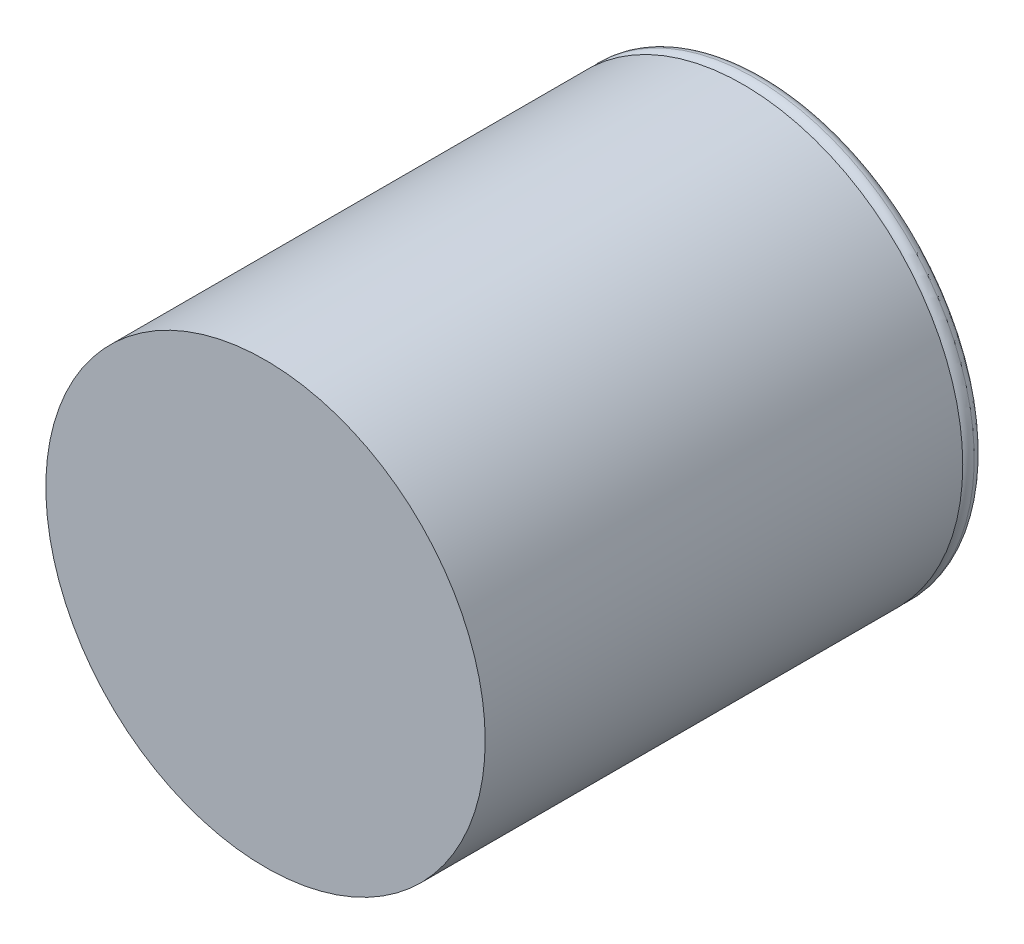
ISO-10303-21;
HEADER;
FILE_DESCRIPTION(('STEP AP214'),'2;1');
FILE_NAME('part.step','',(''),(''),'','','');
FILE_SCHEMA(('AUTOMOTIVE_DESIGN { 1 0 10303 214 1 1 1 1 }'));
ENDSEC;
DATA;
#1=APPLICATION_CONTEXT('core data for automotive mechanical design processes');
#2=APPLICATION_PROTOCOL_DEFINITION('international standard','automotive_design',2000,#1);
#3=PRODUCT_CONTEXT('',#1,'mechanical');
#4=PRODUCT('Part','Part','',(#3));
#5=PRODUCT_RELATED_PRODUCT_CATEGORY('part','',(#4));
#6=PRODUCT_DEFINITION_FORMATION('','',#4);
#7=PRODUCT_DEFINITION_CONTEXT('part definition',#1,'design');
#8=PRODUCT_DEFINITION('design','',#6,#7);
#9=PRODUCT_DEFINITION_SHAPE('','',#8);
#10=(LENGTH_UNIT() NAMED_UNIT(*) SI_UNIT(.MILLI.,.METRE.));
#11=(NAMED_UNIT(*) PLANE_ANGLE_UNIT() SI_UNIT($,.RADIAN.));
#12=(NAMED_UNIT(*) SI_UNIT($,.STERADIAN.) SOLID_ANGLE_UNIT());
#13=UNCERTAINTY_MEASURE_WITH_UNIT(LENGTH_MEASURE(1.E-05),#10,'distance_accuracy_value','');
#14=(GEOMETRIC_REPRESENTATION_CONTEXT(3) GLOBAL_UNCERTAINTY_ASSIGNED_CONTEXT((#13)) GLOBAL_UNIT_ASSIGNED_CONTEXT((#10,
#11,#12)) REPRESENTATION_CONTEXT('',''));
#15=CARTESIAN_POINT('',(0.,0.,0.));
#16=DIRECTION('',(0.,0.,1.));
#17=DIRECTION('',(1.,0.,0.));
#18=AXIS2_PLACEMENT_3D('',#15,#16,#17);
#19=CARTESIAN_POINT('',(0.,0.,25.));
#20=DIRECTION('',(0.,0.,-1.));
#21=DIRECTION('',(-1.,0.,0.));
#22=AXIS2_PLACEMENT_3D('',#19,#20,#21);
#23=CYLINDRICAL_SURFACE('',#22,11.5);
#24=CARTESIAN_POINT('',(0.,0.,25.));
#25=DIRECTION('',(0.,0.,1.));
#26=DIRECTION('',(1.,0.,0.));
#27=AXIS2_PLACEMENT_3D('',#24,#25,#26);
#28=CIRCLE('',#27,11.5);
#29=CARTESIAN_POINT('',(11.5,0.,25.));
#30=VERTEX_POINT('',#29);
#31=EDGE_CURVE('E60',#30,#30,#28,.T.);
#32=ORIENTED_EDGE('',*,*,#31,.F.);
#33=EDGE_LOOP('',(#32));
#34=FACE_BOUND('',#33,.T.);
#35=CARTESIAN_POINT('',(0.,0.,0.));
#36=DIRECTION('',(0.,0.,1.));
#37=DIRECTION('',(1.,0.,0.));
#38=AXIS2_PLACEMENT_3D('',#35,#36,#37);
#39=CIRCLE('',#38,11.5);
#40=CARTESIAN_POINT('',(11.5,0.,0.));
#41=VERTEX_POINT('',#40);
#42=EDGE_CURVE('E57',#41,#41,#39,.T.);
#43=ORIENTED_EDGE('',*,*,#42,.T.);
#44=EDGE_LOOP('',(#43));
#45=FACE_BOUND('',#44,.T.);
#46=ADVANCED_FACE('F33',(#34,#45),#23,.T.);
#47=CARTESIAN_POINT('',(0.,0.,25.));
#48=DIRECTION('',(0.,0.,1.));
#49=DIRECTION('',(1.,0.,0.));
#50=AXIS2_PLACEMENT_3D('',#47,#48,#49);
#51=PLANE('',#50);
#52=ORIENTED_EDGE('',*,*,#31,.T.);
#53=EDGE_LOOP('',(#52));
#54=FACE_BOUND('',#53,.T.);
#55=ADVANCED_FACE('F95',(#54),#51,.T.);
#56=CARTESIAN_POINT('',(0.,0.,0.));
#57=DIRECTION('',(0.,0.,1.));
#58=DIRECTION('',(1.,0.,0.));
#59=AXIS2_PLACEMENT_3D('',#56,#57,#58);
#60=PLANE('',#59);
#61=CARTESIAN_POINT('',(0.,0.,0.));
#62=DIRECTION('',(0.,0.,-1.));
#63=DIRECTION('',(-1.,0.,0.));
#64=AXIS2_PLACEMENT_3D('',#61,#62,#63);
#65=CIRCLE('',#64,7.5);
#66=CARTESIAN_POINT('',(-7.5,0.,0.));
#67=VERTEX_POINT('',#66);
#68=EDGE_CURVE('E56',#67,#67,#65,.T.);
#69=ORIENTED_EDGE('',*,*,#68,.F.);
#70=EDGE_LOOP('',(#69));
#71=FACE_BOUND('',#70,.T.);
#72=ORIENTED_EDGE('',*,*,#42,.F.);
#73=EDGE_LOOP('',(#72));
#74=FACE_BOUND('',#73,.T.);
#75=ADVANCED_FACE('F75',(#71,#74),#60,.F.);
#76=CARTESIAN_POINT('',(0.,0.,-1.1));
#77=DIRECTION('',(0.,0.,-1.));
#78=DIRECTION('',(-1.,0.,0.));
#79=AXIS2_PLACEMENT_3D('',#76,#77,#78);
#80=PLANE('',#79);
#81=CARTESIAN_POINT('',(0.,0.,-1.1));
#82=DIRECTION('',(0.,0.,-1.));
#83=DIRECTION('',(-1.,0.,0.));
#84=AXIS2_PLACEMENT_3D('',#81,#82,#83);
#85=CIRCLE('',#84,2.5);
#86=CARTESIAN_POINT('',(-2.5,0.,-1.1));
#87=VERTEX_POINT('',#86);
#88=EDGE_CURVE('E61',#87,#87,#85,.T.);
#89=ORIENTED_EDGE('',*,*,#88,.F.);
#90=EDGE_LOOP('',(#89));
#91=FACE_BOUND('',#90,.T.);
#92=CARTESIAN_POINT('',(0.,0.,-1.1));
#93=DIRECTION('',(0.,0.,-1.));
#94=DIRECTION('',(-1.,0.,0.));
#95=AXIS2_PLACEMENT_3D('',#92,#93,#94);
#96=CIRCLE('',#95,11.);
#97=CARTESIAN_POINT('',(-11.,0.,-1.1));
#98=VERTEX_POINT('',#97);
#99=EDGE_CURVE('E53',#98,#98,#96,.T.);
#100=ORIENTED_EDGE('',*,*,#99,.T.);
#101=EDGE_LOOP('',(#100));
#102=FACE_BOUND('',#101,.T.);
#103=ADVANCED_FACE('F71',(#91,#102),#80,.T.);
#104=CARTESIAN_POINT('',(0.,0.,-0.1));
#105=DIRECTION('',(0.,0.,-1.));
#106=DIRECTION('',(-1.,0.,0.));
#107=AXIS2_PLACEMENT_3D('',#104,#105,#106);
#108=PLANE('',#107);
#109=CARTESIAN_POINT('',(0.,0.,-0.1));
#110=DIRECTION('',(0.,0.,-1.));
#111=DIRECTION('',(-1.,0.,0.));
#112=AXIS2_PLACEMENT_3D('',#109,#110,#111);
#113=CIRCLE('',#112,11.);
#114=CARTESIAN_POINT('',(-11.,0.,-0.1));
#115=VERTEX_POINT('',#114);
#116=EDGE_CURVE('E40',#115,#115,#113,.F.);
#117=ORIENTED_EDGE('',*,*,#116,.T.);
#118=EDGE_LOOP('',(#117));
#119=FACE_BOUND('',#118,.T.);
#120=CARTESIAN_POINT('',(0.,0.,-0.1));
#121=DIRECTION('',(0.,0.,-1.));
#122=DIRECTION('',(-1.,0.,0.));
#123=AXIS2_PLACEMENT_3D('',#120,#121,#122);
#124=CIRCLE('',#123,7.8);
#125=CARTESIAN_POINT('',(-7.8,0.,-0.1));
#126=VERTEX_POINT('',#125);
#127=EDGE_CURVE('E44',#126,#126,#124,.T.);
#128=ORIENTED_EDGE('',*,*,#127,.T.);
#129=EDGE_LOOP('',(#128));
#130=FACE_BOUND('',#129,.T.);
#131=ADVANCED_FACE('F74',(#119,#130),#108,.F.);
#132=CARTESIAN_POINT('',(0.,0.,-0.6));
#133=DIRECTION('',(0.,0.,-1.));
#134=DIRECTION('',(-1.,0.,0.));
#135=AXIS2_PLACEMENT_3D('',#132,#133,#134);
#136=TOROIDAL_SURFACE('',#135,11.,0.5);
#137=CARTESIAN_POINT('',(0.,0.,-0.6));
#138=DIRECTION('',(0.,0.,-1.));
#139=DIRECTION('',(-1.,0.,0.));
#140=AXIS2_PLACEMENT_3D('',#137,#138,#139);
#141=CIRCLE('',#140,11.5);
#142=CARTESIAN_POINT('',(-11.5,0.,-0.6));
#143=VERTEX_POINT('',#142);
#144=EDGE_CURVE('E48',#143,#143,#141,.F.);
#145=ORIENTED_EDGE('',*,*,#144,.F.);
#146=EDGE_LOOP('',(#145));
#147=FACE_BOUND('',#146,.T.);
#148=ORIENTED_EDGE('',*,*,#99,.F.);
#149=EDGE_LOOP('',(#148));
#150=FACE_BOUND('',#149,.T.);
#151=ADVANCED_FACE('F79',(#147,#150),#136,.T.);
#152=CARTESIAN_POINT('',(0.,0.,-0.6));
#153=DIRECTION('',(0.,0.,-1.));
#154=DIRECTION('',(-1.,0.,0.));
#155=AXIS2_PLACEMENT_3D('',#152,#153,#154);
#156=TOROIDAL_SURFACE('',#155,11.,0.5);
#157=ORIENTED_EDGE('',*,*,#116,.F.);
#158=EDGE_LOOP('',(#157));
#159=FACE_BOUND('',#158,.T.);
#160=ORIENTED_EDGE('',*,*,#144,.T.);
#161=EDGE_LOOP('',(#160));
#162=FACE_BOUND('',#161,.T.);
#163=ADVANCED_FACE('F81',(#159,#162),#156,.T.);
#164=CARTESIAN_POINT('',(0.,0.,0.4));
#165=DIRECTION('',(0.,0.,-1.));
#166=DIRECTION('',(-1.,0.,0.));
#167=AXIS2_PLACEMENT_3D('',#164,#165,#166);
#168=TOROIDAL_SURFACE('',#167,7.8,0.5);
#169=ORIENTED_EDGE('',*,*,#68,.T.);
#170=EDGE_LOOP('',(#169));
#171=FACE_BOUND('',#170,.T.);
#172=ORIENTED_EDGE('',*,*,#127,.F.);
#173=EDGE_LOOP('',(#172));
#174=FACE_BOUND('',#173,.T.);
#175=ADVANCED_FACE('F88',(#171,#174),#168,.F.);
#176=CARTESIAN_POINT('',(0.,0.,-0.6));
#177=DIRECTION('',(0.,0.,-1.));
#178=DIRECTION('',(-1.,0.,0.));
#179=AXIS2_PLACEMENT_3D('',#176,#177,#178);
#180=PLANE('',#179);
#181=CARTESIAN_POINT('',(0.,0.,-0.6));
#182=DIRECTION('',(0.,0.,-1.));
#183=DIRECTION('',(-1.,0.,0.));
#184=AXIS2_PLACEMENT_3D('',#181,#182,#183);
#185=CIRCLE('',#184,2.00000000000001);
#186=CARTESIAN_POINT('',(-2.00000000000001,0.,-0.6));
#187=VERTEX_POINT('',#186);
#188=EDGE_CURVE('E10',#187,#187,#185,.T.);
#189=ORIENTED_EDGE('',*,*,#188,.T.);
#190=EDGE_LOOP('',(#189));
#191=FACE_BOUND('',#190,.T.);
#192=ADVANCED_FACE('F108',(#191),#180,.T.);
#193=CARTESIAN_POINT('',(0.,0.,-0.6));
#194=DIRECTION('',(0.,0.,-1.));
#195=DIRECTION('',(-1.,0.,0.));
#196=AXIS2_PLACEMENT_3D('',#193,#194,#195);
#197=CONICAL_SURFACE('',#196,2.00000000000001,0.78539816339745);
#198=ORIENTED_EDGE('',*,*,#88,.T.);
#199=EDGE_LOOP('',(#198));
#200=FACE_BOUND('',#199,.T.);
#201=ORIENTED_EDGE('',*,*,#188,.F.);
#202=EDGE_LOOP('',(#201));
#203=FACE_BOUND('',#202,.T.);
#204=ADVANCED_FACE('F35',(#200,#203),#197,.F.);
#205=CLOSED_SHELL('',(#46,#55,#75,#103,#131,#151,#163,#175,#192,#204));
#206=MANIFOLD_SOLID_BREP('B2',#205);
#207=ADVANCED_BREP_SHAPE_REPRESENTATION('',(#18,#206),#14);
#208=SHAPE_DEFINITION_REPRESENTATION(#9,#207);
ENDSEC;
END-ISO-10303-21;
